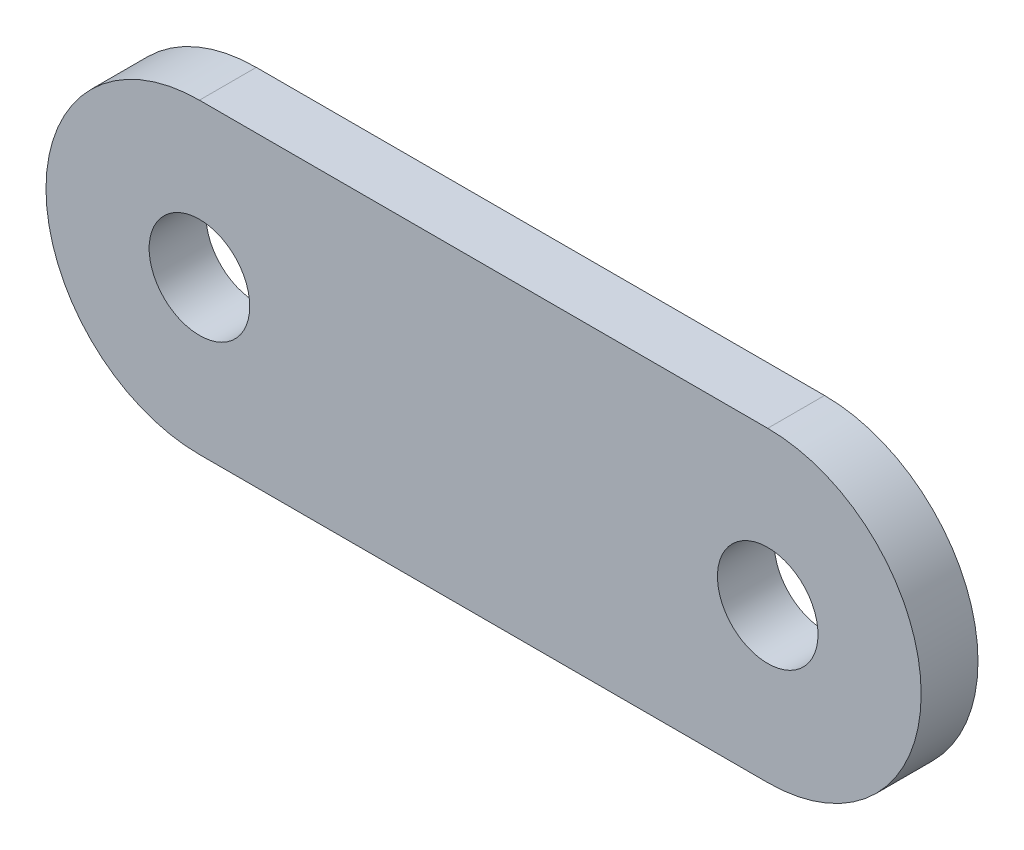
ISO-10303-21;
HEADER;
FILE_DESCRIPTION(('STEP AP214'),'2;1');
FILE_NAME('part.step','',(''),(''),'','','');
FILE_SCHEMA(('AUTOMOTIVE_DESIGN { 1 0 10303 214 1 1 1 1 }'));
ENDSEC;
DATA;
#1=APPLICATION_CONTEXT('core data for automotive mechanical design processes');
#2=APPLICATION_PROTOCOL_DEFINITION('international standard','automotive_design',2000,#1);
#3=PRODUCT_CONTEXT('',#1,'mechanical');
#4=PRODUCT('Part','Part','',(#3));
#5=PRODUCT_RELATED_PRODUCT_CATEGORY('part','',(#4));
#6=PRODUCT_DEFINITION_FORMATION('','',#4);
#7=PRODUCT_DEFINITION_CONTEXT('part definition',#1,'design');
#8=PRODUCT_DEFINITION('design','',#6,#7);
#9=PRODUCT_DEFINITION_SHAPE('','',#8);
#10=(LENGTH_UNIT() NAMED_UNIT(*) SI_UNIT(.MILLI.,.METRE.));
#11=(NAMED_UNIT(*) PLANE_ANGLE_UNIT() SI_UNIT($,.RADIAN.));
#12=(NAMED_UNIT(*) SI_UNIT($,.STERADIAN.) SOLID_ANGLE_UNIT());
#13=UNCERTAINTY_MEASURE_WITH_UNIT(LENGTH_MEASURE(1.E-05),#10,'distance_accuracy_value','');
#14=(GEOMETRIC_REPRESENTATION_CONTEXT(3) GLOBAL_UNCERTAINTY_ASSIGNED_CONTEXT((#13)) GLOBAL_UNIT_ASSIGNED_CONTEXT((#10,
#11,#12)) REPRESENTATION_CONTEXT('',''));
#15=CARTESIAN_POINT('',(0.,0.,0.));
#16=DIRECTION('',(0.,0.,1.));
#17=DIRECTION('',(1.,0.,0.));
#18=AXIS2_PLACEMENT_3D('',#15,#16,#17);
#19=CARTESIAN_POINT('',(0.,-13.5,5.));
#20=DIRECTION('',(0.,1.,0.));
#21=DIRECTION('',(0.,0.,1.));
#22=AXIS2_PLACEMENT_3D('',#19,#20,#21);
#23=PLANE('',#22);
#24=DIRECTION('',(1.,0.,0.));
#25=VECTOR('',#24,1.);
#26=CARTESIAN_POINT('',(0.,-13.5,0.));
#27=LINE('',#26,#25);
#28=CARTESIAN_POINT('',(0.,-13.5,0.));
#29=VERTEX_POINT('',#28);
#30=CARTESIAN_POINT('',(50.,-13.5,0.));
#31=VERTEX_POINT('',#30);
#32=EDGE_CURVE('E106',#29,#31,#27,.T.);
#33=ORIENTED_EDGE('',*,*,#32,.T.);
#34=DIRECTION('',(0.,0.,-1.));
#35=VECTOR('',#34,1.);
#36=CARTESIAN_POINT('',(50.,-13.5,5.));
#37=LINE('',#36,#35);
#38=CARTESIAN_POINT('',(50.,-13.5,5.));
#39=VERTEX_POINT('',#38);
#40=EDGE_CURVE('E11',#39,#31,#37,.T.);
#41=ORIENTED_EDGE('',*,*,#40,.F.);
#42=DIRECTION('',(1.,0.,0.));
#43=VECTOR('',#42,1.);
#44=CARTESIAN_POINT('',(0.,-13.5,5.));
#45=LINE('',#44,#43);
#46=CARTESIAN_POINT('',(0.,-13.5,5.));
#47=VERTEX_POINT('',#46);
#48=EDGE_CURVE('E85',#47,#39,#45,.T.);
#49=ORIENTED_EDGE('',*,*,#48,.F.);
#50=DIRECTION('',(0.,0.,-1.));
#51=VECTOR('',#50,1.);
#52=CARTESIAN_POINT('',(0.,-13.5,5.));
#53=LINE('',#52,#51);
#54=EDGE_CURVE('E105',#47,#29,#53,.T.);
#55=ORIENTED_EDGE('',*,*,#54,.T.);
#56=EDGE_LOOP('',(#33,#41,#49,#55));
#57=FACE_BOUND('',#56,.T.);
#58=ADVANCED_FACE('F37',(#57),#23,.F.);
#59=CARTESIAN_POINT('',(50.,0.,5.));
#60=DIRECTION('',(0.,0.,-1.));
#61=DIRECTION('',(-1.,0.,0.));
#62=AXIS2_PLACEMENT_3D('',#59,#60,#61);
#63=CYLINDRICAL_SURFACE('',#62,13.5);
#64=CARTESIAN_POINT('',(50.,0.,0.));
#65=DIRECTION('',(0.,0.,1.));
#66=DIRECTION('',(1.,0.,0.));
#67=AXIS2_PLACEMENT_3D('',#64,#65,#66);
#68=CIRCLE('',#67,13.5);
#69=CARTESIAN_POINT('',(50.,13.5,0.));
#70=VERTEX_POINT('',#69);
#71=EDGE_CURVE('E90',#31,#70,#68,.T.);
#72=ORIENTED_EDGE('',*,*,#71,.T.);
#73=DIRECTION('',(0.,0.,-1.));
#74=VECTOR('',#73,1.);
#75=CARTESIAN_POINT('',(50.,13.5,5.));
#76=LINE('',#75,#74);
#77=CARTESIAN_POINT('',(50.,13.5,5.));
#78=VERTEX_POINT('',#77);
#79=EDGE_CURVE('E45',#78,#70,#76,.T.);
#80=ORIENTED_EDGE('',*,*,#79,.F.);
#81=CARTESIAN_POINT('',(50.,0.,5.));
#82=DIRECTION('',(0.,0.,1.));
#83=DIRECTION('',(1.,0.,0.));
#84=AXIS2_PLACEMENT_3D('',#81,#82,#83);
#85=CIRCLE('',#84,13.5);
#86=EDGE_CURVE('E79',#39,#78,#85,.T.);
#87=ORIENTED_EDGE('',*,*,#86,.F.);
#88=ORIENTED_EDGE('',*,*,#40,.T.);
#89=EDGE_LOOP('',(#72,#80,#87,#88));
#90=FACE_BOUND('',#89,.T.);
#91=ADVANCED_FACE('F89',(#90),#63,.T.);
#92=CARTESIAN_POINT('',(0.,13.5,5.));
#93=DIRECTION('',(0.,1.,0.));
#94=DIRECTION('',(0.,0.,1.));
#95=AXIS2_PLACEMENT_3D('',#92,#93,#94);
#96=PLANE('',#95);
#97=DIRECTION('',(1.,0.,0.));
#98=VECTOR('',#97,1.);
#99=CARTESIAN_POINT('',(0.,13.5,0.));
#100=LINE('',#99,#98);
#101=CARTESIAN_POINT('',(0.,13.5,0.));
#102=VERTEX_POINT('',#101);
#103=EDGE_CURVE('E110',#102,#70,#100,.T.);
#104=ORIENTED_EDGE('',*,*,#103,.F.);
#105=DIRECTION('',(0.,0.,-1.));
#106=VECTOR('',#105,1.);
#107=CARTESIAN_POINT('',(0.,13.5,5.));
#108=LINE('',#107,#106);
#109=CARTESIAN_POINT('',(0.,13.5,5.));
#110=VERTEX_POINT('',#109);
#111=EDGE_CURVE('E69',#110,#102,#108,.T.);
#112=ORIENTED_EDGE('',*,*,#111,.F.);
#113=DIRECTION('',(1.,0.,0.));
#114=VECTOR('',#113,1.);
#115=CARTESIAN_POINT('',(0.,13.5,5.));
#116=LINE('',#115,#114);
#117=EDGE_CURVE('E83',#110,#78,#116,.T.);
#118=ORIENTED_EDGE('',*,*,#117,.T.);
#119=ORIENTED_EDGE('',*,*,#79,.T.);
#120=EDGE_LOOP('',(#104,#112,#118,#119));
#121=FACE_BOUND('',#120,.T.);
#122=ADVANCED_FACE('F94',(#121),#96,.T.);
#123=CARTESIAN_POINT('',(0.,0.,5.));
#124=DIRECTION('',(0.,0.,-1.));
#125=DIRECTION('',(-1.,0.,0.));
#126=AXIS2_PLACEMENT_3D('',#123,#124,#125);
#127=CYLINDRICAL_SURFACE('',#126,4.425);
#128=CARTESIAN_POINT('',(0.,0.,5.));
#129=DIRECTION('',(0.,0.,1.));
#130=DIRECTION('',(1.,0.,0.));
#131=AXIS2_PLACEMENT_3D('',#128,#129,#130);
#132=CIRCLE('',#131,4.425);
#133=CARTESIAN_POINT('',(4.425,0.,5.));
#134=VERTEX_POINT('',#133);
#135=EDGE_CURVE('E96',#134,#134,#132,.T.);
#136=ORIENTED_EDGE('',*,*,#135,.T.);
#137=EDGE_LOOP('',(#136));
#138=FACE_BOUND('',#137,.T.);
#139=CARTESIAN_POINT('',(0.,0.,0.));
#140=DIRECTION('',(0.,0.,1.));
#141=DIRECTION('',(1.,0.,0.));
#142=AXIS2_PLACEMENT_3D('',#139,#140,#141);
#143=CIRCLE('',#142,4.425);
#144=CARTESIAN_POINT('',(4.425,0.,0.));
#145=VERTEX_POINT('',#144);
#146=EDGE_CURVE('E113',#145,#145,#143,.T.);
#147=ORIENTED_EDGE('',*,*,#146,.F.);
#148=EDGE_LOOP('',(#147));
#149=FACE_BOUND('',#148,.T.);
#150=ADVANCED_FACE('F141',(#138,#149),#127,.F.);
#151=CARTESIAN_POINT('',(0.,0.,5.));
#152=DIRECTION('',(0.,0.,-1.));
#153=DIRECTION('',(-1.,0.,0.));
#154=AXIS2_PLACEMENT_3D('',#151,#152,#153);
#155=CYLINDRICAL_SURFACE('',#154,13.5);
#156=CARTESIAN_POINT('',(0.,0.,0.));
#157=DIRECTION('',(0.,0.,1.));
#158=DIRECTION('',(1.,0.,0.));
#159=AXIS2_PLACEMENT_3D('',#156,#157,#158);
#160=CIRCLE('',#159,13.5);
#161=EDGE_CURVE('E72',#102,#29,#160,.T.);
#162=ORIENTED_EDGE('',*,*,#161,.T.);
#163=ORIENTED_EDGE('',*,*,#54,.F.);
#164=CARTESIAN_POINT('',(0.,0.,5.));
#165=DIRECTION('',(0.,0.,1.));
#166=DIRECTION('',(1.,0.,0.));
#167=AXIS2_PLACEMENT_3D('',#164,#165,#166);
#168=CIRCLE('',#167,13.5);
#169=EDGE_CURVE('E53',#110,#47,#168,.T.);
#170=ORIENTED_EDGE('',*,*,#169,.F.);
#171=ORIENTED_EDGE('',*,*,#111,.T.);
#172=EDGE_LOOP('',(#162,#163,#170,#171));
#173=FACE_BOUND('',#172,.T.);
#174=ADVANCED_FACE('F133',(#173),#155,.T.);
#175=CARTESIAN_POINT('',(50.,0.,5.));
#176=DIRECTION('',(0.,0.,-1.));
#177=DIRECTION('',(-1.,0.,0.));
#178=AXIS2_PLACEMENT_3D('',#175,#176,#177);
#179=CYLINDRICAL_SURFACE('',#178,4.425);
#180=CARTESIAN_POINT('',(50.,0.,5.));
#181=DIRECTION('',(0.,0.,1.));
#182=DIRECTION('',(1.,0.,0.));
#183=AXIS2_PLACEMENT_3D('',#180,#181,#182);
#184=CIRCLE('',#183,4.425);
#185=CARTESIAN_POINT('',(54.425,0.,5.));
#186=VERTEX_POINT('',#185);
#187=EDGE_CURVE('E102',#186,#186,#184,.T.);
#188=ORIENTED_EDGE('',*,*,#187,.T.);
#189=EDGE_LOOP('',(#188));
#190=FACE_BOUND('',#189,.T.);
#191=CARTESIAN_POINT('',(50.,0.,0.));
#192=DIRECTION('',(0.,0.,1.));
#193=DIRECTION('',(1.,0.,0.));
#194=AXIS2_PLACEMENT_3D('',#191,#192,#193);
#195=CIRCLE('',#194,4.425);
#196=CARTESIAN_POINT('',(54.425,0.,0.));
#197=VERTEX_POINT('',#196);
#198=EDGE_CURVE('E116',#197,#197,#195,.T.);
#199=ORIENTED_EDGE('',*,*,#198,.F.);
#200=EDGE_LOOP('',(#199));
#201=FACE_BOUND('',#200,.T.);
#202=ADVANCED_FACE('F131',(#190,#201),#179,.F.);
#203=CARTESIAN_POINT('',(0.,0.,5.));
#204=DIRECTION('',(0.,0.,1.));
#205=DIRECTION('',(1.,0.,0.));
#206=AXIS2_PLACEMENT_3D('',#203,#204,#205);
#207=PLANE('',#206);
#208=ORIENTED_EDGE('',*,*,#48,.T.);
#209=ORIENTED_EDGE('',*,*,#86,.T.);
#210=ORIENTED_EDGE('',*,*,#117,.F.);
#211=ORIENTED_EDGE('',*,*,#169,.T.);
#212=EDGE_LOOP('',(#208,#209,#210,#211));
#213=FACE_BOUND('',#212,.T.);
#214=ORIENTED_EDGE('',*,*,#135,.F.);
#215=EDGE_LOOP('',(#214));
#216=FACE_BOUND('',#215,.T.);
#217=ORIENTED_EDGE('',*,*,#187,.F.);
#218=EDGE_LOOP('',(#217));
#219=FACE_BOUND('',#218,.T.);
#220=ADVANCED_FACE('F80',(#213,#216,#219),#207,.T.);
#221=CARTESIAN_POINT('',(0.,0.,0.));
#222=DIRECTION('',(0.,0.,1.));
#223=DIRECTION('',(1.,0.,0.));
#224=AXIS2_PLACEMENT_3D('',#221,#222,#223);
#225=PLANE('',#224);
#226=ORIENTED_EDGE('',*,*,#32,.F.);
#227=ORIENTED_EDGE('',*,*,#161,.F.);
#228=ORIENTED_EDGE('',*,*,#103,.T.);
#229=ORIENTED_EDGE('',*,*,#71,.F.);
#230=EDGE_LOOP('',(#226,#227,#228,#229));
#231=FACE_BOUND('',#230,.T.);
#232=ORIENTED_EDGE('',*,*,#146,.T.);
#233=EDGE_LOOP('',(#232));
#234=FACE_BOUND('',#233,.T.);
#235=ORIENTED_EDGE('',*,*,#198,.T.);
#236=EDGE_LOOP('',(#235));
#237=FACE_BOUND('',#236,.T.);
#238=ADVANCED_FACE('F123',(#231,#234,#237),#225,.F.);
#239=CLOSED_SHELL('',(#58,#91,#122,#150,#174,#202,#220,#238));
#240=MANIFOLD_SOLID_BREP('B2',#239);
#241=ADVANCED_BREP_SHAPE_REPRESENTATION('',(#18,#240),#14);
#242=SHAPE_DEFINITION_REPRESENTATION(#9,#241);
ENDSEC;
END-ISO-10303-21;
